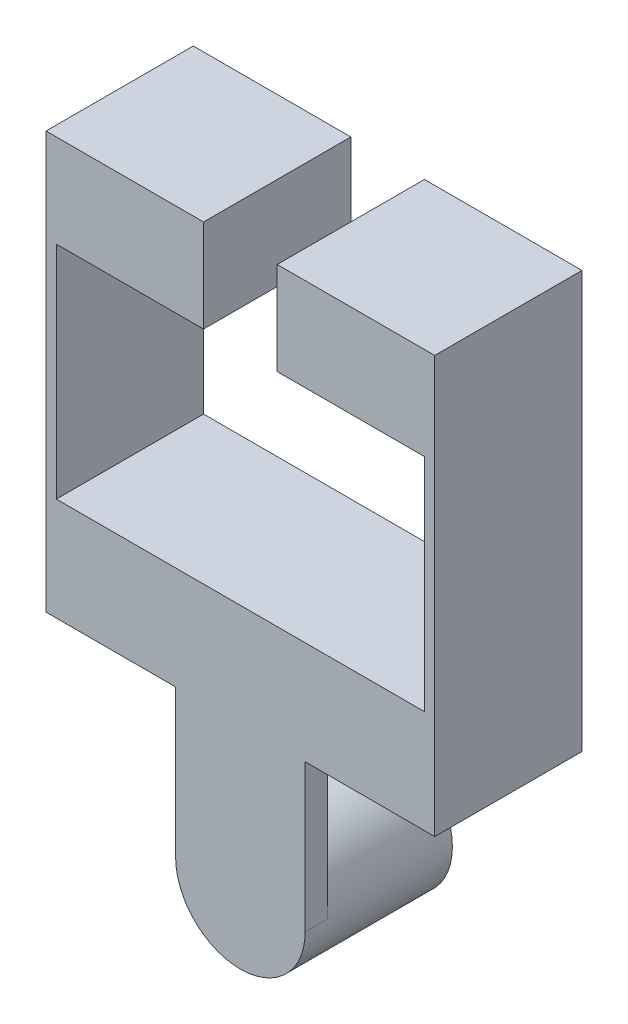
ISO-10303-21;
HEADER;
FILE_DESCRIPTION(('STEP AP214'),'2;1');
FILE_NAME('part.step','',(''),(''),'','','');
FILE_SCHEMA(('AUTOMOTIVE_DESIGN { 1 0 10303 214 1 1 1 1 }'));
ENDSEC;
DATA;
#1=APPLICATION_CONTEXT('core data for automotive mechanical design processes');
#2=APPLICATION_PROTOCOL_DEFINITION('international standard','automotive_design',2000,#1);
#3=PRODUCT_CONTEXT('',#1,'mechanical');
#4=PRODUCT('Part','Part','',(#3));
#5=PRODUCT_RELATED_PRODUCT_CATEGORY('part','',(#4));
#6=PRODUCT_DEFINITION_FORMATION('','',#4);
#7=PRODUCT_DEFINITION_CONTEXT('part definition',#1,'design');
#8=PRODUCT_DEFINITION('design','',#6,#7);
#9=PRODUCT_DEFINITION_SHAPE('','',#8);
#10=(LENGTH_UNIT() NAMED_UNIT(*) SI_UNIT(.MILLI.,.METRE.));
#11=(NAMED_UNIT(*) PLANE_ANGLE_UNIT() SI_UNIT($,.RADIAN.));
#12=(NAMED_UNIT(*) SI_UNIT($,.STERADIAN.) SOLID_ANGLE_UNIT());
#13=UNCERTAINTY_MEASURE_WITH_UNIT(LENGTH_MEASURE(1.E-05),#10,'distance_accuracy_value','');
#14=(GEOMETRIC_REPRESENTATION_CONTEXT(3) GLOBAL_UNCERTAINTY_ASSIGNED_CONTEXT((#13)) GLOBAL_UNIT_ASSIGNED_CONTEXT((#10,
#11,#12)) REPRESENTATION_CONTEXT('',''));
#15=CARTESIAN_POINT('',(0.,0.,0.));
#16=DIRECTION('',(0.,0.,1.));
#17=DIRECTION('',(1.,0.,0.));
#18=AXIS2_PLACEMENT_3D('',#15,#16,#17);
#19=CARTESIAN_POINT('',(-51.9213170731707,-17.9340596383422,25.4));
#20=DIRECTION('',(0.,1.,0.));
#21=DIRECTION('',(-1.,0.,0.));
#22=AXIS2_PLACEMENT_3D('',#19,#20,#21);
#23=PLANE('',#22);
#24=DIRECTION('',(0.,0.,1.));
#25=VECTOR('',#24,1.);
#26=CARTESIAN_POINT('',(-7.21731707317072,-17.9340596383422,21.59));
#27=LINE('',#26,#25);
#28=CARTESIAN_POINT('',(-7.21731707317072,-17.9340596383422,21.59));
#29=VERTEX_POINT('',#28);
#30=CARTESIAN_POINT('',(-7.21731707317072,-17.9340596383422,25.4));
#31=VERTEX_POINT('',#30);
#32=EDGE_CURVE('E185',#29,#31,#27,.T.);
#33=ORIENTED_EDGE('',*,*,#32,.F.);
#34=DIRECTION('',(-1.,0.,0.));
#35=VECTOR('',#34,1.);
#36=CARTESIAN_POINT('',(-7.21731707317072,-17.9340596383422,21.59));
#37=LINE('',#36,#35);
#38=CARTESIAN_POINT('',(-29.5693170731707,-17.9340596383422,21.59));
#39=VERTEX_POINT('',#38);
#40=EDGE_CURVE('E259',#29,#39,#37,.T.);
#41=ORIENTED_EDGE('',*,*,#40,.T.);
#42=DIRECTION('',(0.,0.,1.));
#43=VECTOR('',#42,1.);
#44=CARTESIAN_POINT('',(-29.5693170731707,-17.9340596383422,21.59));
#45=LINE('',#44,#43);
#46=CARTESIAN_POINT('',(-29.5693170731707,-17.9340596383422,25.4));
#47=VERTEX_POINT('',#46);
#48=EDGE_CURVE('E268',#39,#47,#45,.T.);
#49=ORIENTED_EDGE('',*,*,#48,.T.);
#50=DIRECTION('',(1.,0.,0.));
#51=VECTOR('',#50,1.);
#52=CARTESIAN_POINT('',(-51.9213170731707,-17.9340596383422,25.4));
#53=LINE('',#52,#51);
#54=CARTESIAN_POINT('',(-51.9213170731707,-17.9340596383422,25.4));
#55=VERTEX_POINT('',#54);
#56=EDGE_CURVE('E175',#55,#47,#53,.T.);
#57=ORIENTED_EDGE('',*,*,#56,.F.);
#58=DIRECTION('',(0.,0.,-1.));
#59=VECTOR('',#58,1.);
#60=CARTESIAN_POINT('',(-51.9213170731707,-17.9340596383422,25.4));
#61=LINE('',#60,#59);
#62=CARTESIAN_POINT('',(-51.9213170731707,-17.9340596383422,0.));
#63=VERTEX_POINT('',#62);
#64=EDGE_CURVE('E46',#55,#63,#61,.T.);
#65=ORIENTED_EDGE('',*,*,#64,.T.);
#66=DIRECTION('',(1.,0.,0.));
#67=VECTOR('',#66,1.);
#68=CARTESIAN_POINT('',(-51.9213170731707,-17.9340596383422,0.));
#69=LINE('',#68,#67);
#70=CARTESIAN_POINT('',(15.1346829268293,-17.9340596383422,0.));
#71=VERTEX_POINT('',#70);
#72=EDGE_CURVE('E207',#63,#71,#69,.T.);
#73=ORIENTED_EDGE('',*,*,#72,.T.);
#74=DIRECTION('',(0.,0.,-1.));
#75=VECTOR('',#74,1.);
#76=CARTESIAN_POINT('',(15.1346829268293,-17.9340596383422,25.4));
#77=LINE('',#76,#75);
#78=CARTESIAN_POINT('',(15.1346829268293,-17.9340596383422,25.4));
#79=VERTEX_POINT('',#78);
#80=EDGE_CURVE('E152',#79,#71,#77,.T.);
#81=ORIENTED_EDGE('',*,*,#80,.F.);
#82=EDGE_CURVE('E164',#31,#79,#53,.T.);
#83=ORIENTED_EDGE('',*,*,#82,.F.);
#84=EDGE_LOOP('',(#33,#41,#49,#57,#65,#73,#81,#83));
#85=FACE_BOUND('',#84,.T.);
#86=ADVANCED_FACE('F36',(#85),#23,.F.);
#87=CARTESIAN_POINT('',(-51.9213170731707,-17.9340596383422,25.4));
#88=DIRECTION('',(-1.,0.,0.));
#89=DIRECTION('',(0.,0.,1.));
#90=AXIS2_PLACEMENT_3D('',#87,#88,#89);
#91=PLANE('',#90);
#92=DIRECTION('',(0.,1.,0.));
#93=VECTOR('',#92,1.);
#94=CARTESIAN_POINT('',(-51.9213170731707,-17.9340596383422,0.));
#95=LINE('',#94,#93);
#96=CARTESIAN_POINT('',(-51.9213170731707,53.9479403616578,0.));
#97=VERTEX_POINT('',#96);
#98=EDGE_CURVE('E177',#63,#97,#95,.T.);
#99=ORIENTED_EDGE('',*,*,#98,.F.);
#100=ORIENTED_EDGE('',*,*,#64,.F.);
#101=DIRECTION('',(0.,1.,0.));
#102=VECTOR('',#101,1.);
#103=CARTESIAN_POINT('',(-51.9213170731707,-17.9340596383422,25.4));
#104=LINE('',#103,#102);
#105=CARTESIAN_POINT('',(-51.9213170731707,53.9479403616578,25.4));
#106=VERTEX_POINT('',#105);
#107=EDGE_CURVE('E211',#55,#106,#104,.T.);
#108=ORIENTED_EDGE('',*,*,#107,.T.);
#109=DIRECTION('',(0.,0.,-1.));
#110=VECTOR('',#109,1.);
#111=CARTESIAN_POINT('',(-51.9213170731707,53.9479403616578,25.4));
#112=LINE('',#111,#110);
#113=EDGE_CURVE('E115',#106,#97,#112,.T.);
#114=ORIENTED_EDGE('',*,*,#113,.T.);
#115=EDGE_LOOP('',(#99,#100,#108,#114));
#116=FACE_BOUND('',#115,.T.);
#117=ADVANCED_FACE('F37',(#116),#91,.T.);
#118=CARTESIAN_POINT('',(15.1346829268293,53.9479403616578,25.4));
#119=DIRECTION('',(1.,0.,0.));
#120=DIRECTION('',(0.,1.,0.));
#121=AXIS2_PLACEMENT_3D('',#118,#119,#120);
#122=PLANE('',#121);
#123=DIRECTION('',(0.,-1.,0.));
#124=VECTOR('',#123,1.);
#125=CARTESIAN_POINT('',(15.1346829268293,53.9479403616578,0.));
#126=LINE('',#125,#124);
#127=CARTESIAN_POINT('',(15.1346829268293,53.9479403616578,0.));
#128=VERTEX_POINT('',#127);
#129=EDGE_CURVE('E149',#128,#71,#126,.T.);
#130=ORIENTED_EDGE('',*,*,#129,.F.);
#131=DIRECTION('',(0.,0.,-1.));
#132=VECTOR('',#131,1.);
#133=CARTESIAN_POINT('',(15.1346829268293,53.9479403616578,25.4));
#134=LINE('',#133,#132);
#135=CARTESIAN_POINT('',(15.1346829268293,53.9479403616578,25.4));
#136=VERTEX_POINT('',#135);
#137=EDGE_CURVE('E145',#136,#128,#134,.T.);
#138=ORIENTED_EDGE('',*,*,#137,.F.);
#139=DIRECTION('',(0.,-1.,0.));
#140=VECTOR('',#139,1.);
#141=CARTESIAN_POINT('',(15.1346829268293,53.9479403616578,25.4));
#142=LINE('',#141,#140);
#143=EDGE_CURVE('E150',#136,#79,#142,.T.);
#144=ORIENTED_EDGE('',*,*,#143,.T.);
#145=ORIENTED_EDGE('',*,*,#80,.T.);
#146=EDGE_LOOP('',(#130,#138,#144,#145));
#147=FACE_BOUND('',#146,.T.);
#148=ADVANCED_FACE('F148',(#147),#122,.T.);
#149=CARTESIAN_POINT('',(-12.0433170731707,53.9479403616578,25.4));
#150=DIRECTION('',(0.,1.,0.));
#151=DIRECTION('',(-1.,0.,0.));
#152=AXIS2_PLACEMENT_3D('',#149,#150,#151);
#153=PLANE('',#152);
#154=DIRECTION('',(1.,0.,0.));
#155=VECTOR('',#154,1.);
#156=CARTESIAN_POINT('',(-12.0433170731707,53.9479403616578,0.));
#157=LINE('',#156,#155);
#158=CARTESIAN_POINT('',(-12.0433170731707,53.9479403616578,0.));
#159=VERTEX_POINT('',#158);
#160=EDGE_CURVE('E206',#159,#128,#157,.T.);
#161=ORIENTED_EDGE('',*,*,#160,.F.);
#162=DIRECTION('',(0.,0.,-1.));
#163=VECTOR('',#162,1.);
#164=CARTESIAN_POINT('',(-12.0433170731707,53.9479403616578,25.4));
#165=LINE('',#164,#163);
#166=CARTESIAN_POINT('',(-12.0433170731707,53.9479403616578,25.4));
#167=VERTEX_POINT('',#166);
#168=EDGE_CURVE('E154',#167,#159,#165,.T.);
#169=ORIENTED_EDGE('',*,*,#168,.F.);
#170=DIRECTION('',(1.,0.,0.));
#171=VECTOR('',#170,1.);
#172=CARTESIAN_POINT('',(-12.0433170731707,53.9479403616578,25.4));
#173=LINE('',#172,#171);
#174=EDGE_CURVE('E161',#167,#136,#173,.T.);
#175=ORIENTED_EDGE('',*,*,#174,.T.);
#176=ORIENTED_EDGE('',*,*,#137,.T.);
#177=EDGE_LOOP('',(#161,#169,#175,#176));
#178=FACE_BOUND('',#177,.T.);
#179=ADVANCED_FACE('F169',(#178),#153,.T.);
#180=CARTESIAN_POINT('',(-12.0433170731707,37.9459403616578,25.4));
#181=DIRECTION('',(-1.,0.,0.));
#182=DIRECTION('',(0.,-1.,0.));
#183=AXIS2_PLACEMENT_3D('',#180,#181,#182);
#184=PLANE('',#183);
#185=DIRECTION('',(0.,1.,0.));
#186=VECTOR('',#185,1.);
#187=CARTESIAN_POINT('',(-12.0433170731707,37.9459403616578,0.));
#188=LINE('',#187,#186);
#189=CARTESIAN_POINT('',(-12.0433170731707,37.9459403616578,0.));
#190=VERTEX_POINT('',#189);
#191=EDGE_CURVE('E201',#190,#159,#188,.T.);
#192=ORIENTED_EDGE('',*,*,#191,.F.);
#193=DIRECTION('',(0.,0.,-1.));
#194=VECTOR('',#193,1.);
#195=CARTESIAN_POINT('',(-12.0433170731707,37.9459403616578,25.4));
#196=LINE('',#195,#194);
#197=CARTESIAN_POINT('',(-12.0433170731707,37.9459403616578,25.4));
#198=VERTEX_POINT('',#197);
#199=EDGE_CURVE('E214',#198,#190,#196,.T.);
#200=ORIENTED_EDGE('',*,*,#199,.F.);
#201=DIRECTION('',(0.,1.,0.));
#202=VECTOR('',#201,1.);
#203=CARTESIAN_POINT('',(-12.0433170731707,37.9459403616578,25.4));
#204=LINE('',#203,#202);
#205=EDGE_CURVE('E166',#198,#167,#204,.T.);
#206=ORIENTED_EDGE('',*,*,#205,.T.);
#207=ORIENTED_EDGE('',*,*,#168,.T.);
#208=EDGE_LOOP('',(#192,#200,#206,#207));
#209=FACE_BOUND('',#208,.T.);
#210=ADVANCED_FACE('F323',(#209),#184,.T.);
#211=CARTESIAN_POINT('',(13.3566829268293,37.9459403616578,25.4));
#212=DIRECTION('',(0.,-1.,0.));
#213=DIRECTION('',(0.,0.,-1.));
#214=AXIS2_PLACEMENT_3D('',#211,#212,#213);
#215=PLANE('',#214);
#216=DIRECTION('',(-1.,0.,0.));
#217=VECTOR('',#216,1.);
#218=CARTESIAN_POINT('',(13.3566829268293,37.9459403616578,0.));
#219=LINE('',#218,#217);
#220=CARTESIAN_POINT('',(13.3566829268293,37.9459403616578,0.));
#221=VERTEX_POINT('',#220);
#222=EDGE_CURVE('E199',#221,#190,#219,.T.);
#223=ORIENTED_EDGE('',*,*,#222,.F.);
#224=DIRECTION('',(0.,0.,-1.));
#225=VECTOR('',#224,1.);
#226=CARTESIAN_POINT('',(13.3566829268293,37.9459403616578,25.4));
#227=LINE('',#226,#225);
#228=CARTESIAN_POINT('',(13.3566829268293,37.9459403616578,25.4));
#229=VERTEX_POINT('',#228);
#230=EDGE_CURVE('E220',#229,#221,#227,.T.);
#231=ORIENTED_EDGE('',*,*,#230,.F.);
#232=DIRECTION('',(-1.,0.,0.));
#233=VECTOR('',#232,1.);
#234=CARTESIAN_POINT('',(13.3566829268293,37.9459403616578,25.4));
#235=LINE('',#234,#233);
#236=EDGE_CURVE('E171',#229,#198,#235,.T.);
#237=ORIENTED_EDGE('',*,*,#236,.T.);
#238=ORIENTED_EDGE('',*,*,#199,.T.);
#239=EDGE_LOOP('',(#223,#231,#237,#238));
#240=FACE_BOUND('',#239,.T.);
#241=ADVANCED_FACE('F303',(#240),#215,.T.);
#242=CARTESIAN_POINT('',(13.3566829268293,-0.154059638342201,25.4));
#243=DIRECTION('',(-1.,0.,0.));
#244=DIRECTION('',(0.,0.,1.));
#245=AXIS2_PLACEMENT_3D('',#242,#243,#244);
#246=PLANE('',#245);
#247=DIRECTION('',(0.,1.,0.));
#248=VECTOR('',#247,1.);
#249=CARTESIAN_POINT('',(13.3566829268293,-0.154059638342201,0.));
#250=LINE('',#249,#248);
#251=CARTESIAN_POINT('',(13.3566829268293,-0.154059638342201,0.));
#252=VERTEX_POINT('',#251);
#253=EDGE_CURVE('E197',#252,#221,#250,.T.);
#254=ORIENTED_EDGE('',*,*,#253,.F.);
#255=DIRECTION('',(0.,0.,-1.));
#256=VECTOR('',#255,1.);
#257=CARTESIAN_POINT('',(13.3566829268293,-0.154059638342201,25.4));
#258=LINE('',#257,#256);
#259=CARTESIAN_POINT('',(13.3566829268293,-0.154059638342201,25.4));
#260=VERTEX_POINT('',#259);
#261=EDGE_CURVE('E218',#260,#252,#258,.T.);
#262=ORIENTED_EDGE('',*,*,#261,.F.);
#263=DIRECTION('',(0.,1.,0.));
#264=VECTOR('',#263,1.);
#265=CARTESIAN_POINT('',(13.3566829268293,-0.154059638342201,25.4));
#266=LINE('',#265,#264);
#267=EDGE_CURVE('E293',#260,#229,#266,.T.);
#268=ORIENTED_EDGE('',*,*,#267,.T.);
#269=ORIENTED_EDGE('',*,*,#230,.T.);
#270=EDGE_LOOP('',(#254,#262,#268,#269));
#271=FACE_BOUND('',#270,.T.);
#272=ADVANCED_FACE('F307',(#271),#246,.T.);
#273=CARTESIAN_POINT('',(-50.1433170731707,-0.154059638342201,25.4));
#274=DIRECTION('',(0.,1.,0.));
#275=DIRECTION('',(0.,0.,1.));
#276=AXIS2_PLACEMENT_3D('',#273,#274,#275);
#277=PLANE('',#276);
#278=DIRECTION('',(1.,0.,0.));
#279=VECTOR('',#278,1.);
#280=CARTESIAN_POINT('',(-50.1433170731707,-0.154059638342201,0.));
#281=LINE('',#280,#279);
#282=CARTESIAN_POINT('',(-50.1433170731707,-0.154059638342201,0.));
#283=VERTEX_POINT('',#282);
#284=EDGE_CURVE('E195',#283,#252,#281,.T.);
#285=ORIENTED_EDGE('',*,*,#284,.F.);
#286=DIRECTION('',(0.,0.,-1.));
#287=VECTOR('',#286,1.);
#288=CARTESIAN_POINT('',(-50.1433170731707,-0.154059638342201,25.4));
#289=LINE('',#288,#287);
#290=CARTESIAN_POINT('',(-50.1433170731707,-0.154059638342201,25.4));
#291=VERTEX_POINT('',#290);
#292=EDGE_CURVE('E222',#291,#283,#289,.T.);
#293=ORIENTED_EDGE('',*,*,#292,.F.);
#294=DIRECTION('',(1.,0.,0.));
#295=VECTOR('',#294,1.);
#296=CARTESIAN_POINT('',(-50.1433170731707,-0.154059638342201,25.4));
#297=LINE('',#296,#295);
#298=EDGE_CURVE('E295',#291,#260,#297,.T.);
#299=ORIENTED_EDGE('',*,*,#298,.T.);
#300=ORIENTED_EDGE('',*,*,#261,.T.);
#301=EDGE_LOOP('',(#285,#293,#299,#300));
#302=FACE_BOUND('',#301,.T.);
#303=ADVANCED_FACE('F309',(#302),#277,.T.);
#304=CARTESIAN_POINT('',(-50.1433170731707,37.9459403616578,25.4));
#305=DIRECTION('',(1.,0.,0.));
#306=DIRECTION('',(0.,1.,0.));
#307=AXIS2_PLACEMENT_3D('',#304,#305,#306);
#308=PLANE('',#307);
#309=DIRECTION('',(0.,-1.,0.));
#310=VECTOR('',#309,1.);
#311=CARTESIAN_POINT('',(-50.1433170731707,37.9459403616578,0.));
#312=LINE('',#311,#310);
#313=CARTESIAN_POINT('',(-50.1433170731707,37.9459403616578,0.));
#314=VERTEX_POINT('',#313);
#315=EDGE_CURVE('E193',#314,#283,#312,.T.);
#316=ORIENTED_EDGE('',*,*,#315,.F.);
#317=DIRECTION('',(0.,0.,-1.));
#318=VECTOR('',#317,1.);
#319=CARTESIAN_POINT('',(-50.1433170731707,37.9459403616578,25.4));
#320=LINE('',#319,#318);
#321=CARTESIAN_POINT('',(-50.1433170731707,37.9459403616578,25.4));
#322=VERTEX_POINT('',#321);
#323=EDGE_CURVE('E224',#322,#314,#320,.T.);
#324=ORIENTED_EDGE('',*,*,#323,.F.);
#325=DIRECTION('',(0.,-1.,0.));
#326=VECTOR('',#325,1.);
#327=CARTESIAN_POINT('',(-50.1433170731707,37.9459403616578,25.4));
#328=LINE('',#327,#326);
#329=EDGE_CURVE('E290',#322,#291,#328,.T.);
#330=ORIENTED_EDGE('',*,*,#329,.T.);
#331=ORIENTED_EDGE('',*,*,#292,.T.);
#332=EDGE_LOOP('',(#316,#324,#330,#331));
#333=FACE_BOUND('',#332,.T.);
#334=ADVANCED_FACE('F312',(#333),#308,.T.);
#335=CARTESIAN_POINT('',(-24.7433170731707,37.9459403616578,25.4));
#336=DIRECTION('',(0.,-1.,0.));
#337=DIRECTION('',(1.,0.,0.));
#338=AXIS2_PLACEMENT_3D('',#335,#336,#337);
#339=PLANE('',#338);
#340=DIRECTION('',(-1.,0.,0.));
#341=VECTOR('',#340,1.);
#342=CARTESIAN_POINT('',(-24.7433170731707,37.9459403616578,0.));
#343=LINE('',#342,#341);
#344=CARTESIAN_POINT('',(-24.7433170731707,37.9459403616578,0.));
#345=VERTEX_POINT('',#344);
#346=EDGE_CURVE('E189',#345,#314,#343,.T.);
#347=ORIENTED_EDGE('',*,*,#346,.F.);
#348=DIRECTION('',(0.,0.,-1.));
#349=VECTOR('',#348,1.);
#350=CARTESIAN_POINT('',(-24.7433170731707,37.9459403616578,25.4));
#351=LINE('',#350,#349);
#352=CARTESIAN_POINT('',(-24.7433170731707,37.9459403616578,25.4));
#353=VERTEX_POINT('',#352);
#354=EDGE_CURVE('E223',#353,#345,#351,.T.);
#355=ORIENTED_EDGE('',*,*,#354,.F.);
#356=DIRECTION('',(-1.,0.,0.));
#357=VECTOR('',#356,1.);
#358=CARTESIAN_POINT('',(-24.7433170731707,37.9459403616578,25.4));
#359=LINE('',#358,#357);
#360=EDGE_CURVE('E288',#353,#322,#359,.T.);
#361=ORIENTED_EDGE('',*,*,#360,.T.);
#362=ORIENTED_EDGE('',*,*,#323,.T.);
#363=EDGE_LOOP('',(#347,#355,#361,#362));
#364=FACE_BOUND('',#363,.T.);
#365=ADVANCED_FACE('F318',(#364),#339,.T.);
#366=CARTESIAN_POINT('',(-24.7433170731707,53.9479403616578,25.4));
#367=DIRECTION('',(1.,0.,0.));
#368=DIRECTION('',(0.,0.,-1.));
#369=AXIS2_PLACEMENT_3D('',#366,#367,#368);
#370=PLANE('',#369);
#371=DIRECTION('',(0.,-1.,0.));
#372=VECTOR('',#371,1.);
#373=CARTESIAN_POINT('',(-24.7433170731707,53.9479403616578,0.));
#374=LINE('',#373,#372);
#375=CARTESIAN_POINT('',(-24.7433170731707,53.9479403616578,0.));
#376=VERTEX_POINT('',#375);
#377=EDGE_CURVE('E183',#376,#345,#374,.T.);
#378=ORIENTED_EDGE('',*,*,#377,.F.);
#379=DIRECTION('',(0.,0.,-1.));
#380=VECTOR('',#379,1.);
#381=CARTESIAN_POINT('',(-24.7433170731707,53.9479403616578,25.4));
#382=LINE('',#381,#380);
#383=CARTESIAN_POINT('',(-24.7433170731707,53.9479403616578,25.4));
#384=VERTEX_POINT('',#383);
#385=EDGE_CURVE('E227',#384,#376,#382,.T.);
#386=ORIENTED_EDGE('',*,*,#385,.F.);
#387=DIRECTION('',(0.,-1.,0.));
#388=VECTOR('',#387,1.);
#389=CARTESIAN_POINT('',(-24.7433170731707,53.9479403616578,25.4));
#390=LINE('',#389,#388);
#391=EDGE_CURVE('E284',#384,#353,#390,.T.);
#392=ORIENTED_EDGE('',*,*,#391,.T.);
#393=ORIENTED_EDGE('',*,*,#354,.T.);
#394=EDGE_LOOP('',(#378,#386,#392,#393));
#395=FACE_BOUND('',#394,.T.);
#396=ADVANCED_FACE('F321',(#395),#370,.T.);
#397=CARTESIAN_POINT('',(-51.9213170731707,53.9479403616578,25.4));
#398=DIRECTION('',(0.,1.,0.));
#399=DIRECTION('',(0.,0.,1.));
#400=AXIS2_PLACEMENT_3D('',#397,#398,#399);
#401=PLANE('',#400);
#402=DIRECTION('',(1.,0.,0.));
#403=VECTOR('',#402,1.);
#404=CARTESIAN_POINT('',(-51.9213170731707,53.9479403616578,0.));
#405=LINE('',#404,#403);
#406=EDGE_CURVE('E182',#97,#376,#405,.T.);
#407=ORIENTED_EDGE('',*,*,#406,.F.);
#408=ORIENTED_EDGE('',*,*,#113,.F.);
#409=DIRECTION('',(1.,0.,0.));
#410=VECTOR('',#409,1.);
#411=CARTESIAN_POINT('',(-51.9213170731707,53.9479403616578,25.4));
#412=LINE('',#411,#410);
#413=EDGE_CURVE('E281',#106,#384,#412,.T.);
#414=ORIENTED_EDGE('',*,*,#413,.T.);
#415=ORIENTED_EDGE('',*,*,#385,.T.);
#416=EDGE_LOOP('',(#407,#408,#414,#415));
#417=FACE_BOUND('',#416,.T.);
#418=ADVANCED_FACE('F228',(#417),#401,.T.);
#419=CARTESIAN_POINT('',(0.,0.,25.4));
#420=DIRECTION('',(0.,0.,-1.));
#421=DIRECTION('',(-1.,0.,0.));
#422=AXIS2_PLACEMENT_3D('',#419,#420,#421);
#423=PLANE('',#422);
#424=DIRECTION('',(0.,-1.,0.));
#425=VECTOR('',#424,1.);
#426=CARTESIAN_POINT('',(-29.5693170731707,-17.9340596383422,25.4));
#427=LINE('',#426,#425);
#428=CARTESIAN_POINT('',(-29.5693170731707,-43.3340596383422,25.4));
#429=VERTEX_POINT('',#428);
#430=EDGE_CURVE('E52',#47,#429,#427,.T.);
#431=ORIENTED_EDGE('',*,*,#430,.T.);
#432=CARTESIAN_POINT('',(-18.3933170731707,-43.3340596383422,25.4));
#433=DIRECTION('',(0.,0.,1.));
#434=DIRECTION('',(1.,0.,0.));
#435=AXIS2_PLACEMENT_3D('',#432,#433,#434);
#436=CIRCLE('',#435,11.176);
#437=CARTESIAN_POINT('',(-7.21731707317072,-43.3340596383422,25.4));
#438=VERTEX_POINT('',#437);
#439=EDGE_CURVE('E485',#429,#438,#436,.T.);
#440=ORIENTED_EDGE('',*,*,#439,.T.);
#441=DIRECTION('',(0.,1.,0.));
#442=VECTOR('',#441,1.);
#443=CARTESIAN_POINT('',(-7.21731707317072,-43.3340596383422,25.4));
#444=LINE('',#443,#442);
#445=EDGE_CURVE('E262',#438,#31,#444,.T.);
#446=ORIENTED_EDGE('',*,*,#445,.T.);
#447=ORIENTED_EDGE('',*,*,#82,.T.);
#448=ORIENTED_EDGE('',*,*,#143,.F.);
#449=ORIENTED_EDGE('',*,*,#174,.F.);
#450=ORIENTED_EDGE('',*,*,#205,.F.);
#451=ORIENTED_EDGE('',*,*,#236,.F.);
#452=ORIENTED_EDGE('',*,*,#267,.F.);
#453=ORIENTED_EDGE('',*,*,#298,.F.);
#454=ORIENTED_EDGE('',*,*,#329,.F.);
#455=ORIENTED_EDGE('',*,*,#360,.F.);
#456=ORIENTED_EDGE('',*,*,#391,.F.);
#457=ORIENTED_EDGE('',*,*,#413,.F.);
#458=ORIENTED_EDGE('',*,*,#107,.F.);
#459=ORIENTED_EDGE('',*,*,#56,.T.);
#460=EDGE_LOOP('',(#431,#440,#446,#447,#448,#449,#450,#451,#452,#453,#454,#455,#456,#457,#458,#459));
#461=FACE_BOUND('',#460,.T.);
#462=ADVANCED_FACE('F157',(#461),#423,.F.);
#463=CARTESIAN_POINT('',(0.,0.,0.));
#464=DIRECTION('',(0.,0.,-1.));
#465=DIRECTION('',(-1.,0.,0.));
#466=AXIS2_PLACEMENT_3D('',#463,#464,#465);
#467=PLANE('',#466);
#468=ORIENTED_EDGE('',*,*,#98,.T.);
#469=ORIENTED_EDGE('',*,*,#406,.T.);
#470=ORIENTED_EDGE('',*,*,#377,.T.);
#471=ORIENTED_EDGE('',*,*,#346,.T.);
#472=ORIENTED_EDGE('',*,*,#315,.T.);
#473=ORIENTED_EDGE('',*,*,#284,.T.);
#474=ORIENTED_EDGE('',*,*,#253,.T.);
#475=ORIENTED_EDGE('',*,*,#222,.T.);
#476=ORIENTED_EDGE('',*,*,#191,.T.);
#477=ORIENTED_EDGE('',*,*,#160,.T.);
#478=ORIENTED_EDGE('',*,*,#129,.T.);
#479=ORIENTED_EDGE('',*,*,#72,.F.);
#480=EDGE_LOOP('',(#468,#469,#470,#471,#472,#473,#474,#475,#476,#477,#478,#479));
#481=FACE_BOUND('',#480,.T.);
#482=ADVANCED_FACE('F234',(#481),#467,.T.);
#483=CARTESIAN_POINT('',(-7.21731707317072,-43.3340596383422,21.59));
#484=DIRECTION('',(1.,0.,0.));
#485=DIRECTION('',(0.,1.,0.));
#486=AXIS2_PLACEMENT_3D('',#483,#484,#485);
#487=PLANE('',#486);
#488=ORIENTED_EDGE('',*,*,#445,.F.);
#489=DIRECTION('',(0.,0.,1.));
#490=VECTOR('',#489,1.);
#491=CARTESIAN_POINT('',(-7.21731707317072,-43.3340596383422,21.59));
#492=LINE('',#491,#490);
#493=CARTESIAN_POINT('',(-7.21731707317072,-43.3340596383422,21.59));
#494=VERTEX_POINT('',#493);
#495=EDGE_CURVE('E270',#494,#438,#492,.T.);
#496=ORIENTED_EDGE('',*,*,#495,.F.);
#497=DIRECTION('',(0.,1.,0.));
#498=VECTOR('',#497,1.);
#499=CARTESIAN_POINT('',(-7.21731707317072,-43.3340596383422,21.59));
#500=LINE('',#499,#498);
#501=EDGE_CURVE('E261',#494,#29,#500,.T.);
#502=ORIENTED_EDGE('',*,*,#501,.T.);
#503=ORIENTED_EDGE('',*,*,#32,.T.);
#504=EDGE_LOOP('',(#488,#496,#502,#503));
#505=FACE_BOUND('',#504,.T.);
#506=ADVANCED_FACE('F266',(#505),#487,.T.);
#507=CARTESIAN_POINT('',(-29.5693170731707,-17.9340596383422,21.59));
#508=DIRECTION('',(-1.,0.,0.));
#509=DIRECTION('',(0.,-1.,0.));
#510=AXIS2_PLACEMENT_3D('',#507,#508,#509);
#511=PLANE('',#510);
#512=ORIENTED_EDGE('',*,*,#430,.F.);
#513=ORIENTED_EDGE('',*,*,#48,.F.);
#514=DIRECTION('',(0.,-1.,0.));
#515=VECTOR('',#514,1.);
#516=CARTESIAN_POINT('',(-29.5693170731707,-17.9340596383422,21.59));
#517=LINE('',#516,#515);
#518=CARTESIAN_POINT('',(-29.5693170731707,-43.3340596383422,21.59));
#519=VERTEX_POINT('',#518);
#520=EDGE_CURVE('E263',#39,#519,#517,.T.);
#521=ORIENTED_EDGE('',*,*,#520,.T.);
#522=DIRECTION('',(0.,0.,1.));
#523=VECTOR('',#522,1.);
#524=CARTESIAN_POINT('',(-29.5693170731707,-43.3340596383422,21.59));
#525=LINE('',#524,#523);
#526=EDGE_CURVE('E269',#519,#429,#525,.T.);
#527=ORIENTED_EDGE('',*,*,#526,.T.);
#528=EDGE_LOOP('',(#512,#513,#521,#527));
#529=FACE_BOUND('',#528,.T.);
#530=ADVANCED_FACE('F440',(#529),#511,.T.);
#531=CARTESIAN_POINT('',(0.,0.,21.59));
#532=DIRECTION('',(0.,0.,1.));
#533=DIRECTION('',(1.,0.,0.));
#534=AXIS2_PLACEMENT_3D('',#531,#532,#533);
#535=PLANE('',#534);
#536=ORIENTED_EDGE('',*,*,#501,.F.);
#537=CARTESIAN_POINT('',(-18.3933170731707,-43.3340596383422,21.59));
#538=DIRECTION('',(0.,0.,1.));
#539=DIRECTION('',(1.,0.,0.));
#540=AXIS2_PLACEMENT_3D('',#537,#538,#539);
#541=CIRCLE('',#540,11.176);
#542=EDGE_CURVE('E11',#494,#519,#541,.T.);
#543=ORIENTED_EDGE('',*,*,#542,.T.);
#544=ORIENTED_EDGE('',*,*,#520,.F.);
#545=ORIENTED_EDGE('',*,*,#40,.F.);
#546=EDGE_LOOP('',(#536,#543,#544,#545));
#547=FACE_BOUND('',#546,.T.);
#548=ADVANCED_FACE('F257',(#547),#535,.F.);
#549=CARTESIAN_POINT('',(-18.3933170731707,-43.3340596383422,0.));
#550=DIRECTION('',(0.,0.,1.));
#551=DIRECTION('',(1.,0.,0.));
#552=AXIS2_PLACEMENT_3D('',#549,#550,#551);
#553=CYLINDRICAL_SURFACE('',#552,11.176);
#554=ORIENTED_EDGE('',*,*,#542,.F.);
#555=ORIENTED_EDGE('',*,*,#495,.T.);
#556=ORIENTED_EDGE('',*,*,#439,.F.);
#557=ORIENTED_EDGE('',*,*,#526,.F.);
#558=EDGE_LOOP('',(#554,#555,#556,#557));
#559=FACE_BOUND('',#558,.T.);
#560=CARTESIAN_POINT('',(-18.3933170731707,-43.3340596383422,0.));
#561=DIRECTION('',(0.,0.,1.));
#562=DIRECTION('',(1.,0.,0.));
#563=AXIS2_PLACEMENT_3D('',#560,#561,#562);
#564=CIRCLE('',#563,11.176);
#565=CARTESIAN_POINT('',(-7.21731707317072,-43.3340596383422,0.));
#566=VERTEX_POINT('',#565);
#567=EDGE_CURVE('E274',#566,#566,#564,.T.);
#568=ORIENTED_EDGE('',*,*,#567,.T.);
#569=EDGE_LOOP('',(#568));
#570=FACE_BOUND('',#569,.T.);
#571=ADVANCED_FACE('F454',(#559,#570),#553,.T.);
#572=CARTESIAN_POINT('',(-18.3933170731707,-43.3340596383422,0.));
#573=DIRECTION('',(0.,0.,1.));
#574=DIRECTION('',(1.,0.,0.));
#575=AXIS2_PLACEMENT_3D('',#572,#573,#574);
#576=PLANE('',#575);
#577=ORIENTED_EDGE('',*,*,#567,.F.);
#578=EDGE_LOOP('',(#577));
#579=FACE_BOUND('',#578,.T.);
#580=ADVANCED_FACE('F458',(#579),#576,.F.);
#581=CLOSED_SHELL('',(#86,#117,#148,#179,#210,#241,#272,#303,#334,#365,#396,#418,#462,#482,#506,
#530,#548,#571,#580));
#582=MANIFOLD_SOLID_BREP('B2',#581);
#583=ADVANCED_BREP_SHAPE_REPRESENTATION('',(#18,#582),#14);
#584=SHAPE_DEFINITION_REPRESENTATION(#9,#583);
ENDSEC;
END-ISO-10303-21;
